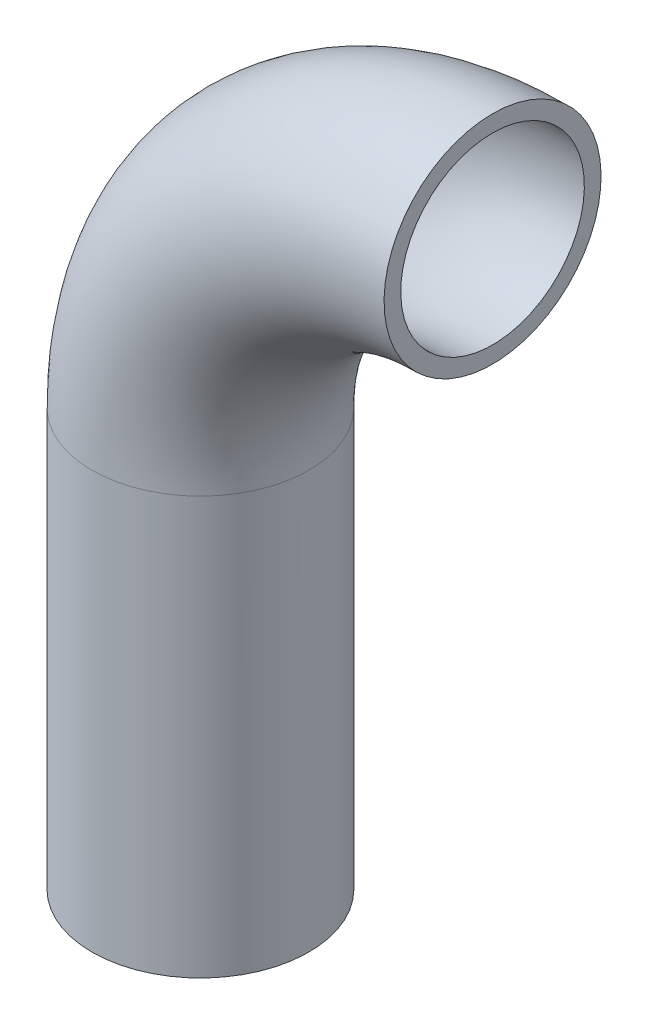
ISO-10303-21;
HEADER;
FILE_DESCRIPTION(('STEP AP214'),'2;1');
FILE_NAME('part.step','',(''),(''),'','','');
FILE_SCHEMA(('AUTOMOTIVE_DESIGN { 1 0 10303 214 1 1 1 1 }'));
ENDSEC;
DATA;
#1=APPLICATION_CONTEXT('core data for automotive mechanical design processes');
#2=APPLICATION_PROTOCOL_DEFINITION('international standard','automotive_design',2000,#1);
#3=PRODUCT_CONTEXT('',#1,'mechanical');
#4=PRODUCT('Part','Part','',(#3));
#5=PRODUCT_RELATED_PRODUCT_CATEGORY('part','',(#4));
#6=PRODUCT_DEFINITION_FORMATION('','',#4);
#7=PRODUCT_DEFINITION_CONTEXT('part definition',#1,'design');
#8=PRODUCT_DEFINITION('design','',#6,#7);
#9=PRODUCT_DEFINITION_SHAPE('','',#8);
#10=(LENGTH_UNIT() NAMED_UNIT(*) SI_UNIT(.MILLI.,.METRE.));
#11=(NAMED_UNIT(*) PLANE_ANGLE_UNIT() SI_UNIT($,.RADIAN.));
#12=(NAMED_UNIT(*) SI_UNIT($,.STERADIAN.) SOLID_ANGLE_UNIT());
#13=UNCERTAINTY_MEASURE_WITH_UNIT(LENGTH_MEASURE(1.E-05),#10,'distance_accuracy_value','');
#14=(GEOMETRIC_REPRESENTATION_CONTEXT(3) GLOBAL_UNCERTAINTY_ASSIGNED_CONTEXT((#13)) GLOBAL_UNIT_ASSIGNED_CONTEXT((#10,
#11,#12)) REPRESENTATION_CONTEXT('',''));
#15=CARTESIAN_POINT('',(0.,0.,0.));
#16=DIRECTION('',(0.,0.,1.));
#17=DIRECTION('',(1.,0.,0.));
#18=AXIS2_PLACEMENT_3D('',#15,#16,#17);
#19=CARTESIAN_POINT('',(0.,0.,0.));
#20=DIRECTION('',(0.,1.,0.));
#21=DIRECTION('',(0.,0.,1.));
#22=AXIS2_PLACEMENT_3D('',#19,#20,#21);
#23=PLANE('',#22);
#24=CARTESIAN_POINT('',(0.,0.,0.));
#25=DIRECTION('',(0.,1.,0.));
#26=DIRECTION('',(0.,0.,1.));
#27=AXIS2_PLACEMENT_3D('',#24,#25,#26);
#28=CIRCLE('',#27,13.);
#29=CARTESIAN_POINT('',(0.,0.,13.));
#30=VERTEX_POINT('',#29);
#31=EDGE_CURVE('E42',#30,#30,#28,.T.);
#32=ORIENTED_EDGE('',*,*,#31,.F.);
#33=EDGE_LOOP('',(#32));
#34=FACE_BOUND('',#33,.T.);
#35=CARTESIAN_POINT('',(0.,0.,0.));
#36=DIRECTION('',(0.,1.,0.));
#37=DIRECTION('',(0.,0.,1.));
#38=AXIS2_PLACEMENT_3D('',#35,#36,#37);
#39=CIRCLE('',#38,11.);
#40=CARTESIAN_POINT('',(0.,0.,11.));
#41=VERTEX_POINT('',#40);
#42=EDGE_CURVE('E52',#41,#41,#39,.T.);
#43=ORIENTED_EDGE('',*,*,#42,.T.);
#44=EDGE_LOOP('',(#43));
#45=FACE_BOUND('',#44,.T.);
#46=ADVANCED_FACE('F31',(#34,#45),#23,.F.);
#47=CARTESIAN_POINT('',(35.,50.,0.));
#48=DIRECTION('',(0.,0.,-1.));
#49=DIRECTION('',(-1.,0.,0.));
#50=AXIS2_PLACEMENT_3D('',#47,#48,#49);
#51=TOROIDAL_SURFACE('',#50,35.,13.);
#52=CARTESIAN_POINT('',(0.,50.,0.));
#53=DIRECTION('',(0.,1.,0.));
#54=DIRECTION('',(0.,0.,1.));
#55=AXIS2_PLACEMENT_3D('',#52,#53,#54);
#56=CIRCLE('',#55,13.);
#57=CARTESIAN_POINT('',(-13.,50.,0.));
#58=VERTEX_POINT('',#57);
#59=EDGE_CURVE('E38',#58,#58,#56,.T.);
#60=CARTESIAN_POINT('',(35.,85.,0.));
#61=DIRECTION('',(1.,0.,0.));
#62=DIRECTION('',(0.,0.,1.));
#63=AXIS2_PLACEMENT_3D('',#60,#61,#62);
#64=CIRCLE('',#63,13.);
#65=CARTESIAN_POINT('',(35.,98.,0.));
#66=VERTEX_POINT('',#65);
#67=EDGE_CURVE('E10',#66,#66,#64,.T.);
#68=CARTESIAN_POINT('',(35.,50.,0.));
#69=DIRECTION('',(0.,0.,-1.));
#70=DIRECTION('',(-1.,0.,0.));
#71=AXIS2_PLACEMENT_3D('',#68,#69,#70);
#72=CIRCLE('',#71,48.);
#73=EDGE_CURVE('',#58,#66,#72,.T.);
#74=ORIENTED_EDGE('',*,*,#59,.T.);
#75=ORIENTED_EDGE('',*,*,#67,.F.);
#76=ORIENTED_EDGE('',*,*,#73,.T.);
#77=ORIENTED_EDGE('',*,*,#73,.F.);
#78=EDGE_LOOP('',(#74,#76,#75,#77));
#79=FACE_BOUND('',#78,.T.);
#80=ADVANCED_FACE('F33',(#79),#51,.T.);
#81=CARTESIAN_POINT('',(0.,50.,0.));
#82=DIRECTION('',(0.,-1.,0.));
#83=DIRECTION('',(0.,0.,-1.));
#84=AXIS2_PLACEMENT_3D('',#81,#82,#83);
#85=CYLINDRICAL_SURFACE('',#84,13.);
#86=ORIENTED_EDGE('',*,*,#59,.F.);
#87=EDGE_LOOP('',(#86));
#88=FACE_BOUND('',#87,.T.);
#89=ORIENTED_EDGE('',*,*,#31,.T.);
#90=EDGE_LOOP('',(#89));
#91=FACE_BOUND('',#90,.T.);
#92=ADVANCED_FACE('F69',(#88,#91),#85,.T.);
#93=CARTESIAN_POINT('',(35.,85.,0.));
#94=DIRECTION('',(1.,0.,0.));
#95=DIRECTION('',(0.,0.,1.));
#96=AXIS2_PLACEMENT_3D('',#93,#94,#95);
#97=PLANE('',#96);
#98=CARTESIAN_POINT('',(35.,85.,0.));
#99=DIRECTION('',(1.,0.,0.));
#100=DIRECTION('',(0.,0.,1.));
#101=AXIS2_PLACEMENT_3D('',#98,#99,#100);
#102=CIRCLE('',#101,11.);
#103=CARTESIAN_POINT('',(35.,96.,0.));
#104=VERTEX_POINT('',#103);
#105=EDGE_CURVE('E47',#104,#104,#102,.T.);
#106=ORIENTED_EDGE('',*,*,#105,.F.);
#107=EDGE_LOOP('',(#106));
#108=FACE_BOUND('',#107,.T.);
#109=ORIENTED_EDGE('',*,*,#67,.T.);
#110=EDGE_LOOP('',(#109));
#111=FACE_BOUND('',#110,.T.);
#112=ADVANCED_FACE('F64',(#108,#111),#97,.T.);
#113=CARTESIAN_POINT('',(35.,50.,0.));
#114=DIRECTION('',(0.,0.,-1.));
#115=DIRECTION('',(-1.,0.,0.));
#116=AXIS2_PLACEMENT_3D('',#113,#114,#115);
#117=TOROIDAL_SURFACE('',#116,35.,11.);
#118=CARTESIAN_POINT('',(0.,50.,0.));
#119=DIRECTION('',(0.,1.,0.));
#120=DIRECTION('',(0.,0.,1.));
#121=AXIS2_PLACEMENT_3D('',#118,#119,#120);
#122=CIRCLE('',#121,11.);
#123=CARTESIAN_POINT('',(-11.,50.,0.));
#124=VERTEX_POINT('',#123);
#125=EDGE_CURVE('E51',#124,#124,#122,.T.);
#126=CARTESIAN_POINT('',(35.,50.,0.));
#127=DIRECTION('',(0.,0.,-1.));
#128=DIRECTION('',(-1.,0.,0.));
#129=AXIS2_PLACEMENT_3D('',#126,#127,#128);
#130=CIRCLE('',#129,46.);
#131=EDGE_CURVE('',#124,#104,#130,.T.);
#132=ORIENTED_EDGE('',*,*,#125,.F.);
#133=ORIENTED_EDGE('',*,*,#105,.T.);
#134=ORIENTED_EDGE('',*,*,#131,.T.);
#135=ORIENTED_EDGE('',*,*,#131,.F.);
#136=EDGE_LOOP('',(#132,#134,#133,#135));
#137=FACE_BOUND('',#136,.T.);
#138=ADVANCED_FACE('F61',(#137),#117,.F.);
#139=CARTESIAN_POINT('',(0.,50.,0.));
#140=DIRECTION('',(0.,-1.,0.));
#141=DIRECTION('',(0.,0.,-1.));
#142=AXIS2_PLACEMENT_3D('',#139,#140,#141);
#143=CYLINDRICAL_SURFACE('',#142,11.);
#144=ORIENTED_EDGE('',*,*,#125,.T.);
#145=EDGE_LOOP('',(#144));
#146=FACE_BOUND('',#145,.T.);
#147=ORIENTED_EDGE('',*,*,#42,.F.);
#148=EDGE_LOOP('',(#147));
#149=FACE_BOUND('',#148,.T.);
#150=ADVANCED_FACE('F58',(#146,#149),#143,.F.);
#151=CLOSED_SHELL('',(#46,#80,#92,#112,#138,#150));
#152=MANIFOLD_SOLID_BREP('B2',#151);
#153=ADVANCED_BREP_SHAPE_REPRESENTATION('',(#18,#152),#14);
#154=SHAPE_DEFINITION_REPRESENTATION(#9,#153);
ENDSEC;
END-ISO-10303-21;
